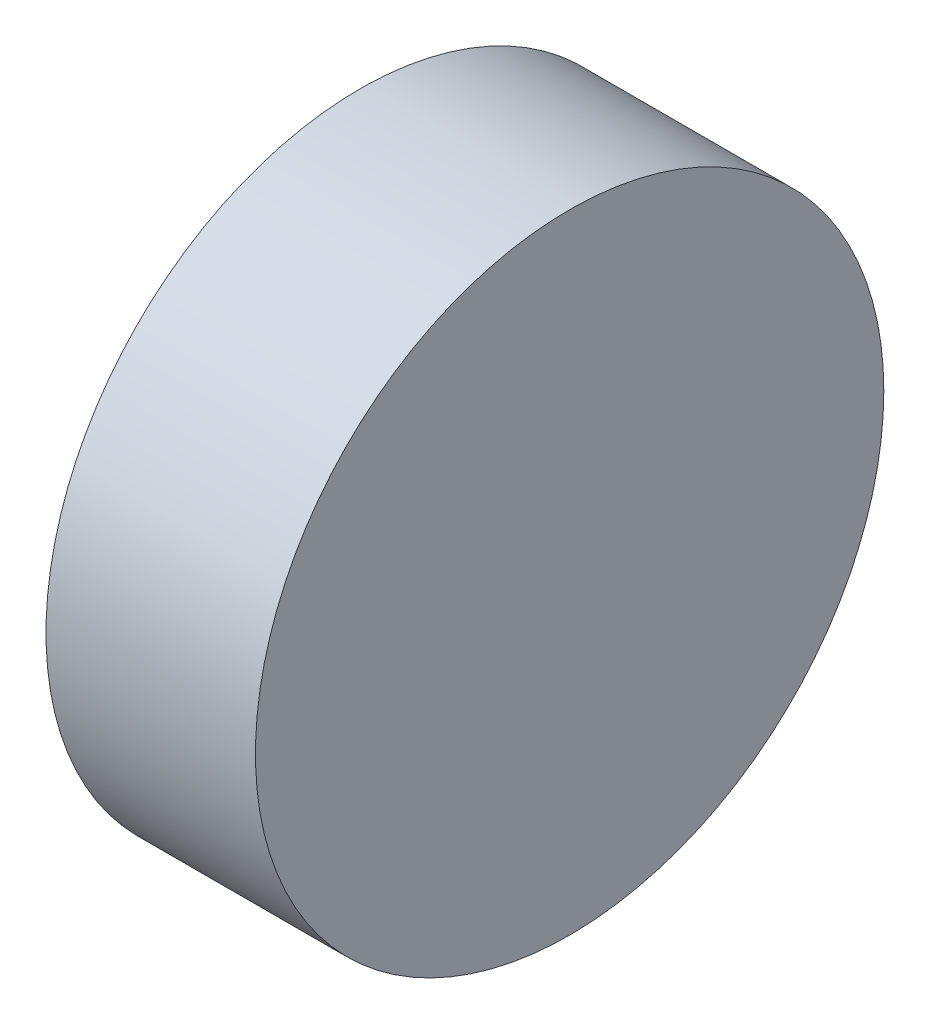
ISO-10303-21;
HEADER;
FILE_DESCRIPTION(('STEP AP214'),'2;1');
FILE_NAME('part.step','',(''),(''),'','','');
FILE_SCHEMA(('AUTOMOTIVE_DESIGN { 1 0 10303 214 1 1 1 1 }'));
ENDSEC;
DATA;
#1=APPLICATION_CONTEXT('core data for automotive mechanical design processes');
#2=APPLICATION_PROTOCOL_DEFINITION('international standard','automotive_design',2000,#1);
#3=PRODUCT_CONTEXT('',#1,'mechanical');
#4=PRODUCT('Part','Part','',(#3));
#5=PRODUCT_RELATED_PRODUCT_CATEGORY('part','',(#4));
#6=PRODUCT_DEFINITION_FORMATION('','',#4);
#7=PRODUCT_DEFINITION_CONTEXT('part definition',#1,'design');
#8=PRODUCT_DEFINITION('design','',#6,#7);
#9=PRODUCT_DEFINITION_SHAPE('','',#8);
#10=(LENGTH_UNIT() NAMED_UNIT(*) SI_UNIT(.MILLI.,.METRE.));
#11=(NAMED_UNIT(*) PLANE_ANGLE_UNIT() SI_UNIT($,.RADIAN.));
#12=(NAMED_UNIT(*) SI_UNIT($,.STERADIAN.) SOLID_ANGLE_UNIT());
#13=UNCERTAINTY_MEASURE_WITH_UNIT(LENGTH_MEASURE(1.E-05),#10,'distance_accuracy_value','');
#14=(GEOMETRIC_REPRESENTATION_CONTEXT(3) GLOBAL_UNCERTAINTY_ASSIGNED_CONTEXT((#13)) GLOBAL_UNIT_ASSIGNED_CONTEXT((#10,
#11,#12)) REPRESENTATION_CONTEXT('',''));
#15=CARTESIAN_POINT('',(0.,0.,0.));
#16=DIRECTION('',(0.,0.,1.));
#17=DIRECTION('',(1.,0.,0.));
#18=AXIS2_PLACEMENT_3D('',#15,#16,#17);
#19=CARTESIAN_POINT('',(0.,0.,0.));
#20=DIRECTION('',(1.,0.,0.));
#21=DIRECTION('',(0.,0.,-1.));
#22=AXIS2_PLACEMENT_3D('',#19,#20,#21);
#23=PLANE('',#22);
#24=CARTESIAN_POINT('',(0.,0.,0.));
#25=DIRECTION('',(1.,0.,0.));
#26=DIRECTION('',(0.,0.,-1.));
#27=AXIS2_PLACEMENT_3D('',#24,#25,#26);
#28=CIRCLE('',#27,30.);
#29=CARTESIAN_POINT('',(0.,0.,-30.));
#30=VERTEX_POINT('',#29);
#31=EDGE_CURVE('E10',#30,#30,#28,.T.);
#32=ORIENTED_EDGE('',*,*,#31,.F.);
#33=EDGE_LOOP('',(#32));
#34=FACE_BOUND('',#33,.T.);
#35=CARTESIAN_POINT('',(0.,0.,0.));
#36=DIRECTION('',(1.,0.,0.));
#37=DIRECTION('',(0.,0.,-1.));
#38=AXIS2_PLACEMENT_3D('',#35,#36,#37);
#39=CIRCLE('',#38,2.5);
#40=CARTESIAN_POINT('',(0.,0.,-2.5));
#41=VERTEX_POINT('',#40);
#42=EDGE_CURVE('E38',#41,#41,#39,.T.);
#43=ORIENTED_EDGE('',*,*,#42,.T.);
#44=EDGE_LOOP('',(#43));
#45=FACE_BOUND('',#44,.T.);
#46=ADVANCED_FACE('F31',(#34,#45),#23,.F.);
#47=CARTESIAN_POINT('',(10.,0.,0.));
#48=DIRECTION('',(-1.,0.,0.));
#49=DIRECTION('',(0.,0.,1.));
#50=AXIS2_PLACEMENT_3D('',#47,#48,#49);
#51=CYLINDRICAL_SURFACE('',#50,30.);
#52=ORIENTED_EDGE('',*,*,#31,.T.);
#53=EDGE_LOOP('',(#52));
#54=FACE_BOUND('',#53,.T.);
#55=CARTESIAN_POINT('',(20.,0.,0.));
#56=DIRECTION('',(1.,0.,0.));
#57=DIRECTION('',(0.,0.,-1.));
#58=AXIS2_PLACEMENT_3D('',#55,#56,#57);
#59=CIRCLE('',#58,30.);
#60=CARTESIAN_POINT('',(20.,0.,-30.));
#61=VERTEX_POINT('',#60);
#62=EDGE_CURVE('E46',#61,#61,#59,.T.);
#63=ORIENTED_EDGE('',*,*,#62,.F.);
#64=EDGE_LOOP('',(#63));
#65=FACE_BOUND('',#64,.T.);
#66=ADVANCED_FACE('F33',(#54,#65),#51,.T.);
#67=CARTESIAN_POINT('',(10.,0.,0.));
#68=DIRECTION('',(-1.,0.,0.));
#69=DIRECTION('',(0.,0.,1.));
#70=AXIS2_PLACEMENT_3D('',#67,#68,#69);
#71=CYLINDRICAL_SURFACE('',#70,2.5);
#72=CARTESIAN_POINT('',(10.,0.,0.));
#73=DIRECTION('',(1.,0.,0.));
#74=DIRECTION('',(0.,0.,-1.));
#75=AXIS2_PLACEMENT_3D('',#72,#73,#74);
#76=CIRCLE('',#75,2.5);
#77=CARTESIAN_POINT('',(10.,0.,-2.5));
#78=VERTEX_POINT('',#77);
#79=EDGE_CURVE('E42',#78,#78,#76,.T.);
#80=ORIENTED_EDGE('',*,*,#79,.T.);
#81=EDGE_LOOP('',(#80));
#82=FACE_BOUND('',#81,.T.);
#83=ORIENTED_EDGE('',*,*,#42,.F.);
#84=EDGE_LOOP('',(#83));
#85=FACE_BOUND('',#84,.T.);
#86=ADVANCED_FACE('F55',(#82,#85),#71,.F.);
#87=CARTESIAN_POINT('',(10.,0.,0.));
#88=DIRECTION('',(1.,0.,0.));
#89=DIRECTION('',(0.,0.,-1.));
#90=AXIS2_PLACEMENT_3D('',#87,#88,#89);
#91=PLANE('',#90);
#92=ORIENTED_EDGE('',*,*,#79,.F.);
#93=EDGE_LOOP('',(#92));
#94=FACE_BOUND('',#93,.T.);
#95=ADVANCED_FACE('F60',(#94),#91,.F.);
#96=CARTESIAN_POINT('',(20.,0.,0.));
#97=DIRECTION('',(1.,0.,0.));
#98=DIRECTION('',(0.,0.,-1.));
#99=AXIS2_PLACEMENT_3D('',#96,#97,#98);
#100=PLANE('',#99);
#101=ORIENTED_EDGE('',*,*,#62,.T.);
#102=EDGE_LOOP('',(#101));
#103=FACE_BOUND('',#102,.T.);
#104=ADVANCED_FACE('F52',(#103),#100,.T.);
#105=CLOSED_SHELL('',(#46,#66,#86,#95,#104));
#106=MANIFOLD_SOLID_BREP('B2',#105);
#107=ADVANCED_BREP_SHAPE_REPRESENTATION('',(#18,#106),#14);
#108=SHAPE_DEFINITION_REPRESENTATION(#9,#107);
ENDSEC;
END-ISO-10303-21;
